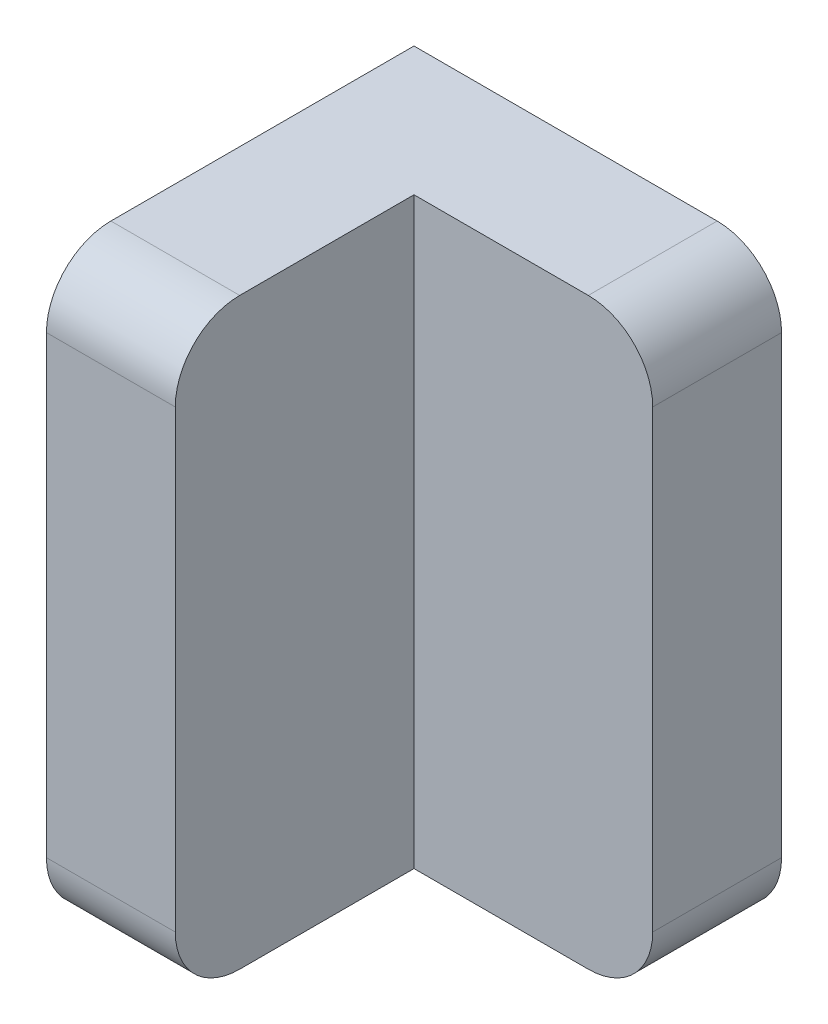
ISO-10303-21;
HEADER;
FILE_DESCRIPTION(('STEP AP214'),'2;1');
FILE_NAME('part.step','',(''),(''),'','','');
FILE_SCHEMA(('AUTOMOTIVE_DESIGN { 1 0 10303 214 1 1 1 1 }'));
ENDSEC;
DATA;
#1=APPLICATION_CONTEXT('core data for automotive mechanical design processes');
#2=APPLICATION_PROTOCOL_DEFINITION('international standard','automotive_design',2000,#1);
#3=PRODUCT_CONTEXT('',#1,'mechanical');
#4=PRODUCT('Part','Part','',(#3));
#5=PRODUCT_RELATED_PRODUCT_CATEGORY('part','',(#4));
#6=PRODUCT_DEFINITION_FORMATION('','',#4);
#7=PRODUCT_DEFINITION_CONTEXT('part definition',#1,'design');
#8=PRODUCT_DEFINITION('design','',#6,#7);
#9=PRODUCT_DEFINITION_SHAPE('','',#8);
#10=(LENGTH_UNIT() NAMED_UNIT(*) SI_UNIT(.MILLI.,.METRE.));
#11=(NAMED_UNIT(*) PLANE_ANGLE_UNIT() SI_UNIT($,.RADIAN.));
#12=(NAMED_UNIT(*) SI_UNIT($,.STERADIAN.) SOLID_ANGLE_UNIT());
#13=UNCERTAINTY_MEASURE_WITH_UNIT(LENGTH_MEASURE(1.E-05),#10,'distance_accuracy_value','');
#14=(GEOMETRIC_REPRESENTATION_CONTEXT(3) GLOBAL_UNCERTAINTY_ASSIGNED_CONTEXT((#13)) GLOBAL_UNIT_ASSIGNED_CONTEXT((#10,
#11,#12)) REPRESENTATION_CONTEXT('',''));
#15=CARTESIAN_POINT('',(0.,0.,0.));
#16=DIRECTION('',(0.,0.,1.));
#17=DIRECTION('',(1.,0.,0.));
#18=AXIS2_PLACEMENT_3D('',#15,#16,#17);
#19=CARTESIAN_POINT('',(0.,3.85,1.7));
#20=DIRECTION('',(1.,0.,0.));
#21=DIRECTION('',(0.,0.,-1.));
#22=AXIS2_PLACEMENT_3D('',#19,#20,#21);
#23=PLANE('',#22);
#24=DIRECTION('',(0.,-1.,0.));
#25=VECTOR('',#24,1.);
#26=CARTESIAN_POINT('',(0.,3.85,0.));
#27=LINE('',#26,#25);
#28=CARTESIAN_POINT('',(0.,3.85,0.));
#29=VERTEX_POINT('',#28);
#30=CARTESIAN_POINT('',(0.,-3.85,0.));
#31=VERTEX_POINT('',#30);
#32=EDGE_CURVE('E156',#29,#31,#27,.T.);
#33=ORIENTED_EDGE('',*,*,#32,.T.);
#34=DIRECTION('',(0.,0.,-1.));
#35=VECTOR('',#34,1.);
#36=CARTESIAN_POINT('',(0.,-3.85,1.7));
#37=LINE('',#36,#35);
#38=CARTESIAN_POINT('',(0.,-3.85,4.));
#39=VERTEX_POINT('',#38);
#40=EDGE_CURVE('E11',#39,#31,#37,.T.);
#41=ORIENTED_EDGE('',*,*,#40,.F.);
#42=CARTESIAN_POINT('',(0.,-3.,4.));
#43=DIRECTION('',(1.,0.,0.));
#44=DIRECTION('',(0.,0.,-1.));
#45=AXIS2_PLACEMENT_3D('',#42,#43,#44);
#46=CIRCLE('',#45,0.85);
#47=CARTESIAN_POINT('',(0.,-3.,4.85));
#48=VERTEX_POINT('',#47);
#49=EDGE_CURVE('E146',#48,#39,#46,.T.);
#50=ORIENTED_EDGE('',*,*,#49,.F.);
#51=DIRECTION('',(0.,-1.,0.));
#52=VECTOR('',#51,1.);
#53=CARTESIAN_POINT('',(0.,3.,4.85));
#54=LINE('',#53,#52);
#55=CARTESIAN_POINT('',(0.,3.,4.85));
#56=VERTEX_POINT('',#55);
#57=EDGE_CURVE('E144',#56,#48,#54,.T.);
#58=ORIENTED_EDGE('',*,*,#57,.F.);
#59=CARTESIAN_POINT('',(0.,3.,4.));
#60=DIRECTION('',(1.,0.,0.));
#61=DIRECTION('',(0.,0.,-1.));
#62=AXIS2_PLACEMENT_3D('',#59,#60,#61);
#63=CIRCLE('',#62,0.85);
#64=CARTESIAN_POINT('',(0.,3.85,4.));
#65=VERTEX_POINT('',#64);
#66=EDGE_CURVE('E142',#65,#56,#63,.T.);
#67=ORIENTED_EDGE('',*,*,#66,.F.);
#68=DIRECTION('',(0.,0.,-1.));
#69=VECTOR('',#68,1.);
#70=CARTESIAN_POINT('',(0.,3.85,1.7));
#71=LINE('',#70,#69);
#72=EDGE_CURVE('E126',#65,#29,#71,.T.);
#73=ORIENTED_EDGE('',*,*,#72,.T.);
#74=EDGE_LOOP('',(#33,#41,#50,#58,#67,#73));
#75=FACE_BOUND('',#74,.T.);
#76=ADVANCED_FACE('F39',(#75),#23,.F.);
#77=CARTESIAN_POINT('',(0.,-3.85,1.7));
#78=DIRECTION('',(0.,1.,0.));
#79=DIRECTION('',(0.,0.,1.));
#80=AXIS2_PLACEMENT_3D('',#77,#78,#79);
#81=PLANE('',#80);
#82=DIRECTION('',(1.,0.,0.));
#83=VECTOR('',#82,1.);
#84=CARTESIAN_POINT('',(0.,-3.85,1.7));
#85=LINE('',#84,#83);
#86=CARTESIAN_POINT('',(1.7,-3.85,1.7));
#87=VERTEX_POINT('',#86);
#88=CARTESIAN_POINT('',(4.,-3.85,1.7));
#89=VERTEX_POINT('',#88);
#90=EDGE_CURVE('E157',#87,#89,#85,.T.);
#91=ORIENTED_EDGE('',*,*,#90,.F.);
#92=DIRECTION('',(0.,0.,-1.));
#93=VECTOR('',#92,1.);
#94=CARTESIAN_POINT('',(1.7,-3.85,4.));
#95=LINE('',#94,#93);
#96=CARTESIAN_POINT('',(1.7,-3.85,4.));
#97=VERTEX_POINT('',#96);
#98=EDGE_CURVE('E120',#97,#87,#95,.T.);
#99=ORIENTED_EDGE('',*,*,#98,.F.);
#100=DIRECTION('',(-1.,0.,0.));
#101=VECTOR('',#100,1.);
#102=CARTESIAN_POINT('',(1.7,-3.85,4.));
#103=LINE('',#102,#101);
#104=EDGE_CURVE('E141',#97,#39,#103,.T.);
#105=ORIENTED_EDGE('',*,*,#104,.T.);
#106=ORIENTED_EDGE('',*,*,#40,.T.);
#107=DIRECTION('',(1.,0.,0.));
#108=VECTOR('',#107,1.);
#109=CARTESIAN_POINT('',(0.,-3.85,0.));
#110=LINE('',#109,#108);
#111=CARTESIAN_POINT('',(4.,-3.85,0.));
#112=VERTEX_POINT('',#111);
#113=EDGE_CURVE('E169',#31,#112,#110,.T.);
#114=ORIENTED_EDGE('',*,*,#113,.T.);
#115=DIRECTION('',(0.,0.,-1.));
#116=VECTOR('',#115,1.);
#117=CARTESIAN_POINT('',(4.,-3.85,1.7));
#118=LINE('',#117,#116);
#119=EDGE_CURVE('E46',#89,#112,#118,.T.);
#120=ORIENTED_EDGE('',*,*,#119,.F.);
#121=EDGE_LOOP('',(#91,#99,#105,#106,#114,#120));
#122=FACE_BOUND('',#121,.T.);
#123=ADVANCED_FACE('F211',(#122),#81,.F.);
#124=CARTESIAN_POINT('',(4.,-3.,1.7));
#125=DIRECTION('',(0.,0.,-1.));
#126=DIRECTION('',(-1.,0.,0.));
#127=AXIS2_PLACEMENT_3D('',#124,#125,#126);
#128=CYLINDRICAL_SURFACE('',#127,0.85);
#129=CARTESIAN_POINT('',(4.,-3.,0.));
#130=DIRECTION('',(0.,0.,1.));
#131=DIRECTION('',(1.,0.,0.));
#132=AXIS2_PLACEMENT_3D('',#129,#130,#131);
#133=CIRCLE('',#132,0.85);
#134=CARTESIAN_POINT('',(4.85,-3.,0.));
#135=VERTEX_POINT('',#134);
#136=EDGE_CURVE('E171',#112,#135,#133,.T.);
#137=ORIENTED_EDGE('',*,*,#136,.T.);
#138=DIRECTION('',(0.,0.,-1.));
#139=VECTOR('',#138,1.);
#140=CARTESIAN_POINT('',(4.85,-3.,1.7));
#141=LINE('',#140,#139);
#142=CARTESIAN_POINT('',(4.85,-3.,1.7));
#143=VERTEX_POINT('',#142);
#144=EDGE_CURVE('E185',#143,#135,#141,.T.);
#145=ORIENTED_EDGE('',*,*,#144,.F.);
#146=CARTESIAN_POINT('',(4.,-3.,1.7));
#147=DIRECTION('',(0.,0.,1.));
#148=DIRECTION('',(1.,0.,0.));
#149=AXIS2_PLACEMENT_3D('',#146,#147,#148);
#150=CIRCLE('',#149,0.85);
#151=EDGE_CURVE('E159',#89,#143,#150,.T.);
#152=ORIENTED_EDGE('',*,*,#151,.F.);
#153=ORIENTED_EDGE('',*,*,#119,.T.);
#154=EDGE_LOOP('',(#137,#145,#152,#153));
#155=FACE_BOUND('',#154,.T.);
#156=ADVANCED_FACE('F192',(#155),#128,.T.);
#157=CARTESIAN_POINT('',(4.85,-3.,1.7));
#158=DIRECTION('',(-1.,0.,0.));
#159=DIRECTION('',(0.,0.,1.));
#160=AXIS2_PLACEMENT_3D('',#157,#158,#159);
#161=PLANE('',#160);
#162=DIRECTION('',(0.,1.,0.));
#163=VECTOR('',#162,1.);
#164=CARTESIAN_POINT('',(4.85,-3.,0.));
#165=LINE('',#164,#163);
#166=CARTESIAN_POINT('',(4.85,3.,0.));
#167=VERTEX_POINT('',#166);
#168=EDGE_CURVE('E173',#135,#167,#165,.T.);
#169=ORIENTED_EDGE('',*,*,#168,.T.);
#170=DIRECTION('',(0.,0.,-1.));
#171=VECTOR('',#170,1.);
#172=CARTESIAN_POINT('',(4.85,3.,1.7));
#173=LINE('',#172,#171);
#174=CARTESIAN_POINT('',(4.85,3.,1.7));
#175=VERTEX_POINT('',#174);
#176=EDGE_CURVE('E182',#175,#167,#173,.T.);
#177=ORIENTED_EDGE('',*,*,#176,.F.);
#178=DIRECTION('',(0.,1.,0.));
#179=VECTOR('',#178,1.);
#180=CARTESIAN_POINT('',(4.85,-3.,1.7));
#181=LINE('',#180,#179);
#182=EDGE_CURVE('E162',#143,#175,#181,.T.);
#183=ORIENTED_EDGE('',*,*,#182,.F.);
#184=ORIENTED_EDGE('',*,*,#144,.T.);
#185=EDGE_LOOP('',(#169,#177,#183,#184));
#186=FACE_BOUND('',#185,.T.);
#187=ADVANCED_FACE('F203',(#186),#161,.F.);
#188=CARTESIAN_POINT('',(4.,3.,1.7));
#189=DIRECTION('',(0.,0.,-1.));
#190=DIRECTION('',(-1.,0.,0.));
#191=AXIS2_PLACEMENT_3D('',#188,#189,#190);
#192=CYLINDRICAL_SURFACE('',#191,0.85);
#193=CARTESIAN_POINT('',(4.,3.,0.));
#194=DIRECTION('',(0.,0.,1.));
#195=DIRECTION('',(1.,0.,0.));
#196=AXIS2_PLACEMENT_3D('',#193,#194,#195);
#197=CIRCLE('',#196,0.85);
#198=CARTESIAN_POINT('',(4.,3.85,0.));
#199=VERTEX_POINT('',#198);
#200=EDGE_CURVE('E175',#167,#199,#197,.T.);
#201=ORIENTED_EDGE('',*,*,#200,.T.);
#202=DIRECTION('',(0.,0.,-1.));
#203=VECTOR('',#202,1.);
#204=CARTESIAN_POINT('',(4.,3.85,1.7));
#205=LINE('',#204,#203);
#206=CARTESIAN_POINT('',(4.,3.85,1.7));
#207=VERTEX_POINT('',#206);
#208=EDGE_CURVE('E179',#207,#199,#205,.T.);
#209=ORIENTED_EDGE('',*,*,#208,.F.);
#210=CARTESIAN_POINT('',(4.,3.,1.7));
#211=DIRECTION('',(0.,0.,1.));
#212=DIRECTION('',(1.,0.,0.));
#213=AXIS2_PLACEMENT_3D('',#210,#211,#212);
#214=CIRCLE('',#213,0.85);
#215=EDGE_CURVE('E164',#175,#207,#214,.T.);
#216=ORIENTED_EDGE('',*,*,#215,.F.);
#217=ORIENTED_EDGE('',*,*,#176,.T.);
#218=EDGE_LOOP('',(#201,#209,#216,#217));
#219=FACE_BOUND('',#218,.T.);
#220=ADVANCED_FACE('F207',(#219),#192,.T.);
#221=CARTESIAN_POINT('',(4.,3.85,1.7));
#222=DIRECTION('',(0.,-1.,0.));
#223=DIRECTION('',(0.,0.,-1.));
#224=AXIS2_PLACEMENT_3D('',#221,#222,#223);
#225=PLANE('',#224);
#226=DIRECTION('',(-1.,0.,0.));
#227=VECTOR('',#226,1.);
#228=CARTESIAN_POINT('',(4.,3.85,0.));
#229=LINE('',#228,#227);
#230=EDGE_CURVE('E160',#199,#29,#229,.T.);
#231=ORIENTED_EDGE('',*,*,#230,.T.);
#232=ORIENTED_EDGE('',*,*,#72,.F.);
#233=DIRECTION('',(-1.,0.,0.));
#234=VECTOR('',#233,1.);
#235=CARTESIAN_POINT('',(1.7,3.85,4.));
#236=LINE('',#235,#234);
#237=CARTESIAN_POINT('',(1.7,3.85,4.));
#238=VERTEX_POINT('',#237);
#239=EDGE_CURVE('E123',#238,#65,#236,.T.);
#240=ORIENTED_EDGE('',*,*,#239,.F.);
#241=DIRECTION('',(0.,0.,1.));
#242=VECTOR('',#241,1.);
#243=CARTESIAN_POINT('',(1.7,3.85,0.));
#244=LINE('',#243,#242);
#245=CARTESIAN_POINT('',(1.7,3.85,1.7));
#246=VERTEX_POINT('',#245);
#247=EDGE_CURVE('E112',#246,#238,#244,.T.);
#248=ORIENTED_EDGE('',*,*,#247,.F.);
#249=DIRECTION('',(-1.,0.,0.));
#250=VECTOR('',#249,1.);
#251=CARTESIAN_POINT('',(4.,3.85,1.7));
#252=LINE('',#251,#250);
#253=EDGE_CURVE('E53',#207,#246,#252,.T.);
#254=ORIENTED_EDGE('',*,*,#253,.F.);
#255=ORIENTED_EDGE('',*,*,#208,.T.);
#256=EDGE_LOOP('',(#231,#232,#240,#248,#254,#255));
#257=FACE_BOUND('',#256,.T.);
#258=ADVANCED_FACE('F124',(#257),#225,.F.);
#259=CARTESIAN_POINT('',(4.,-3.,1.7));
#260=DIRECTION('',(0.,0.,1.));
#261=DIRECTION('',(1.,0.,0.));
#262=AXIS2_PLACEMENT_3D('',#259,#260,#261);
#263=PLANE('',#262);
#264=DIRECTION('',(0.,1.,0.));
#265=VECTOR('',#264,1.);
#266=CARTESIAN_POINT('',(1.7,-3.,1.7));
#267=LINE('',#266,#265);
#268=EDGE_CURVE('E57',#87,#246,#267,.T.);
#269=ORIENTED_EDGE('',*,*,#268,.F.);
#270=ORIENTED_EDGE('',*,*,#90,.T.);
#271=ORIENTED_EDGE('',*,*,#151,.T.);
#272=ORIENTED_EDGE('',*,*,#182,.T.);
#273=ORIENTED_EDGE('',*,*,#215,.T.);
#274=ORIENTED_EDGE('',*,*,#253,.T.);
#275=EDGE_LOOP('',(#269,#270,#271,#272,#273,#274));
#276=FACE_BOUND('',#275,.T.);
#277=ADVANCED_FACE('F209',(#276),#263,.T.);
#278=CARTESIAN_POINT('',(4.,-3.,0.));
#279=DIRECTION('',(0.,0.,1.));
#280=DIRECTION('',(1.,0.,0.));
#281=AXIS2_PLACEMENT_3D('',#278,#279,#280);
#282=PLANE('',#281);
#283=ORIENTED_EDGE('',*,*,#136,.F.);
#284=ORIENTED_EDGE('',*,*,#113,.F.);
#285=ORIENTED_EDGE('',*,*,#32,.F.);
#286=ORIENTED_EDGE('',*,*,#230,.F.);
#287=ORIENTED_EDGE('',*,*,#200,.F.);
#288=ORIENTED_EDGE('',*,*,#168,.F.);
#289=EDGE_LOOP('',(#283,#284,#285,#286,#287,#288));
#290=FACE_BOUND('',#289,.T.);
#291=ADVANCED_FACE('F197',(#290),#282,.F.);
#292=CARTESIAN_POINT('',(1.7,3.,4.));
#293=DIRECTION('',(-1.,0.,0.));
#294=DIRECTION('',(0.,0.,1.));
#295=AXIS2_PLACEMENT_3D('',#292,#293,#294);
#296=CYLINDRICAL_SURFACE('',#295,0.85);
#297=ORIENTED_EDGE('',*,*,#66,.T.);
#298=DIRECTION('',(-1.,0.,0.));
#299=VECTOR('',#298,1.);
#300=CARTESIAN_POINT('',(1.7,3.,4.85));
#301=LINE('',#300,#299);
#302=CARTESIAN_POINT('',(1.7,3.,4.85));
#303=VERTEX_POINT('',#302);
#304=EDGE_CURVE('E129',#303,#56,#301,.T.);
#305=ORIENTED_EDGE('',*,*,#304,.F.);
#306=CARTESIAN_POINT('',(1.7,3.,4.));
#307=DIRECTION('',(1.,0.,0.));
#308=DIRECTION('',(0.,0.,-1.));
#309=AXIS2_PLACEMENT_3D('',#306,#307,#308);
#310=CIRCLE('',#309,0.85);
#311=EDGE_CURVE('E117',#238,#303,#310,.T.);
#312=ORIENTED_EDGE('',*,*,#311,.F.);
#313=ORIENTED_EDGE('',*,*,#239,.T.);
#314=EDGE_LOOP('',(#297,#305,#312,#313));
#315=FACE_BOUND('',#314,.T.);
#316=ADVANCED_FACE('F131',(#315),#296,.T.);
#317=CARTESIAN_POINT('',(1.7,3.,4.85));
#318=DIRECTION('',(0.,0.,-1.));
#319=DIRECTION('',(-1.,0.,0.));
#320=AXIS2_PLACEMENT_3D('',#317,#318,#319);
#321=PLANE('',#320);
#322=ORIENTED_EDGE('',*,*,#57,.T.);
#323=DIRECTION('',(-1.,0.,0.));
#324=VECTOR('',#323,1.);
#325=CARTESIAN_POINT('',(1.7,-3.,4.85));
#326=LINE('',#325,#324);
#327=CARTESIAN_POINT('',(1.7,-3.,4.85));
#328=VERTEX_POINT('',#327);
#329=EDGE_CURVE('E151',#328,#48,#326,.T.);
#330=ORIENTED_EDGE('',*,*,#329,.F.);
#331=DIRECTION('',(0.,-1.,0.));
#332=VECTOR('',#331,1.);
#333=CARTESIAN_POINT('',(1.7,3.,4.85));
#334=LINE('',#333,#332);
#335=EDGE_CURVE('E134',#303,#328,#334,.T.);
#336=ORIENTED_EDGE('',*,*,#335,.F.);
#337=ORIENTED_EDGE('',*,*,#304,.T.);
#338=EDGE_LOOP('',(#322,#330,#336,#337));
#339=FACE_BOUND('',#338,.T.);
#340=ADVANCED_FACE('F221',(#339),#321,.F.);
#341=CARTESIAN_POINT('',(1.7,-3.,4.));
#342=DIRECTION('',(-1.,0.,0.));
#343=DIRECTION('',(0.,0.,1.));
#344=AXIS2_PLACEMENT_3D('',#341,#342,#343);
#345=CYLINDRICAL_SURFACE('',#344,0.85);
#346=ORIENTED_EDGE('',*,*,#49,.T.);
#347=ORIENTED_EDGE('',*,*,#104,.F.);
#348=CARTESIAN_POINT('',(1.7,-3.,4.));
#349=DIRECTION('',(1.,0.,0.));
#350=DIRECTION('',(0.,0.,-1.));
#351=AXIS2_PLACEMENT_3D('',#348,#349,#350);
#352=CIRCLE('',#351,0.85);
#353=EDGE_CURVE('E136',#328,#97,#352,.T.);
#354=ORIENTED_EDGE('',*,*,#353,.F.);
#355=ORIENTED_EDGE('',*,*,#329,.T.);
#356=EDGE_LOOP('',(#346,#347,#354,#355));
#357=FACE_BOUND('',#356,.T.);
#358=ADVANCED_FACE('F216',(#357),#345,.T.);
#359=CARTESIAN_POINT('',(1.7,3.,4.));
#360=DIRECTION('',(1.,0.,0.));
#361=DIRECTION('',(0.,0.,-1.));
#362=AXIS2_PLACEMENT_3D('',#359,#360,#361);
#363=PLANE('',#362);
#364=ORIENTED_EDGE('',*,*,#98,.T.);
#365=ORIENTED_EDGE('',*,*,#268,.T.);
#366=ORIENTED_EDGE('',*,*,#247,.T.);
#367=ORIENTED_EDGE('',*,*,#311,.T.);
#368=ORIENTED_EDGE('',*,*,#335,.T.);
#369=ORIENTED_EDGE('',*,*,#353,.T.);
#370=EDGE_LOOP('',(#364,#365,#366,#367,#368,#369));
#371=FACE_BOUND('',#370,.T.);
#372=ADVANCED_FACE('F115',(#371),#363,.T.);
#373=CLOSED_SHELL('',(#76,#123,#156,#187,#220,#258,#277,#291,#316,#340,#358,#372));
#374=MANIFOLD_SOLID_BREP('B2',#373);
#375=ADVANCED_BREP_SHAPE_REPRESENTATION('',(#18,#374),#14);
#376=SHAPE_DEFINITION_REPRESENTATION(#9,#375);
ENDSEC;
END-ISO-10303-21;
